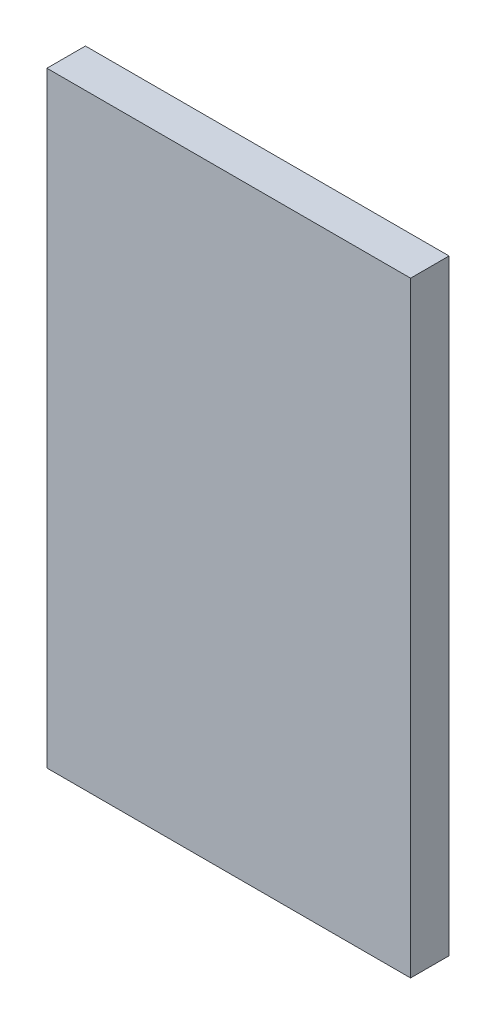
ISO-10303-21;
HEADER;
FILE_DESCRIPTION(('STEP AP214'),'2;1');
FILE_NAME('part.step','',(''),(''),'','','');
FILE_SCHEMA(('AUTOMOTIVE_DESIGN { 1 0 10303 214 1 1 1 1 }'));
ENDSEC;
DATA;
#1=APPLICATION_CONTEXT('core data for automotive mechanical design processes');
#2=APPLICATION_PROTOCOL_DEFINITION('international standard','automotive_design',2000,#1);
#3=PRODUCT_CONTEXT('',#1,'mechanical');
#4=PRODUCT('Part','Part','',(#3));
#5=PRODUCT_RELATED_PRODUCT_CATEGORY('part','',(#4));
#6=PRODUCT_DEFINITION_FORMATION('','',#4);
#7=PRODUCT_DEFINITION_CONTEXT('part definition',#1,'design');
#8=PRODUCT_DEFINITION('design','',#6,#7);
#9=PRODUCT_DEFINITION_SHAPE('','',#8);
#10=(LENGTH_UNIT() NAMED_UNIT(*) SI_UNIT(.MILLI.,.METRE.));
#11=(NAMED_UNIT(*) PLANE_ANGLE_UNIT() SI_UNIT($,.RADIAN.));
#12=(NAMED_UNIT(*) SI_UNIT($,.STERADIAN.) SOLID_ANGLE_UNIT());
#13=UNCERTAINTY_MEASURE_WITH_UNIT(LENGTH_MEASURE(1.E-05),#10,'distance_accuracy_value','');
#14=(GEOMETRIC_REPRESENTATION_CONTEXT(3) GLOBAL_UNCERTAINTY_ASSIGNED_CONTEXT((#13)) GLOBAL_UNIT_ASSIGNED_CONTEXT((#10,
#11,#12)) REPRESENTATION_CONTEXT('',''));
#15=CARTESIAN_POINT('',(0.,0.,0.));
#16=DIRECTION('',(0.,0.,1.));
#17=DIRECTION('',(1.,0.,0.));
#18=AXIS2_PLACEMENT_3D('',#15,#16,#17);
#19=CARTESIAN_POINT('',(0.,0.,6.35));
#20=DIRECTION('',(1.,0.,0.));
#21=DIRECTION('',(0.,1.,0.));
#22=AXIS2_PLACEMENT_3D('',#19,#20,#21);
#23=PLANE('',#22);
#24=DIRECTION('',(0.,-1.,0.));
#25=VECTOR('',#24,1.);
#26=CARTESIAN_POINT('',(0.,0.,0.));
#27=LINE('',#26,#25);
#28=CARTESIAN_POINT('',(0.,100.,0.));
#29=VERTEX_POINT('',#28);
#30=CARTESIAN_POINT('',(0.,0.,0.));
#31=VERTEX_POINT('',#30);
#32=EDGE_CURVE('E107',#29,#31,#27,.T.);
#33=ORIENTED_EDGE('',*,*,#32,.T.);
#34=DIRECTION('',(0.,0.,-1.));
#35=VECTOR('',#34,1.);
#36=CARTESIAN_POINT('',(0.,0.,6.35));
#37=LINE('',#36,#35);
#38=CARTESIAN_POINT('',(0.,0.,6.35));
#39=VERTEX_POINT('',#38);
#40=EDGE_CURVE('E11',#39,#31,#37,.T.);
#41=ORIENTED_EDGE('',*,*,#40,.F.);
#42=DIRECTION('',(0.,-1.,0.));
#43=VECTOR('',#42,1.);
#44=CARTESIAN_POINT('',(0.,0.,6.35));
#45=LINE('',#44,#43);
#46=CARTESIAN_POINT('',(0.,100.,6.35));
#47=VERTEX_POINT('',#46);
#48=EDGE_CURVE('E91',#47,#39,#45,.T.);
#49=ORIENTED_EDGE('',*,*,#48,.F.);
#50=DIRECTION('',(0.,0.,-1.));
#51=VECTOR('',#50,1.);
#52=CARTESIAN_POINT('',(0.,100.,6.35));
#53=LINE('',#52,#51);
#54=EDGE_CURVE('E103',#47,#29,#53,.T.);
#55=ORIENTED_EDGE('',*,*,#54,.T.);
#56=EDGE_LOOP('',(#33,#41,#49,#55));
#57=FACE_BOUND('',#56,.T.);
#58=ADVANCED_FACE('F39',(#57),#23,.F.);
#59=CARTESIAN_POINT('',(0.,0.,6.35));
#60=DIRECTION('',(0.,1.,0.));
#61=DIRECTION('',(0.,0.,1.));
#62=AXIS2_PLACEMENT_3D('',#59,#60,#61);
#63=PLANE('',#62);
#64=DIRECTION('',(1.,0.,0.));
#65=VECTOR('',#64,1.);
#66=CARTESIAN_POINT('',(0.,0.,0.));
#67=LINE('',#66,#65);
#68=CARTESIAN_POINT('',(60.,0.,0.));
#69=VERTEX_POINT('',#68);
#70=EDGE_CURVE('E96',#31,#69,#67,.T.);
#71=ORIENTED_EDGE('',*,*,#70,.T.);
#72=DIRECTION('',(0.,0.,-1.));
#73=VECTOR('',#72,1.);
#74=CARTESIAN_POINT('',(60.,0.,6.35));
#75=LINE('',#74,#73);
#76=CARTESIAN_POINT('',(60.,0.,6.35));
#77=VERTEX_POINT('',#76);
#78=EDGE_CURVE('E48',#77,#69,#75,.T.);
#79=ORIENTED_EDGE('',*,*,#78,.F.);
#80=DIRECTION('',(1.,0.,0.));
#81=VECTOR('',#80,1.);
#82=CARTESIAN_POINT('',(0.,0.,6.35));
#83=LINE('',#82,#81);
#84=EDGE_CURVE('E86',#39,#77,#83,.T.);
#85=ORIENTED_EDGE('',*,*,#84,.F.);
#86=ORIENTED_EDGE('',*,*,#40,.T.);
#87=EDGE_LOOP('',(#71,#79,#85,#86));
#88=FACE_BOUND('',#87,.T.);
#89=ADVANCED_FACE('F95',(#88),#63,.F.);
#90=CARTESIAN_POINT('',(60.,0.,6.35));
#91=DIRECTION('',(-1.,0.,0.));
#92=DIRECTION('',(0.,-1.,0.));
#93=AXIS2_PLACEMENT_3D('',#90,#91,#92);
#94=PLANE('',#93);
#95=DIRECTION('',(0.,1.,0.));
#96=VECTOR('',#95,1.);
#97=CARTESIAN_POINT('',(60.,0.,0.));
#98=LINE('',#97,#96);
#99=CARTESIAN_POINT('',(60.,100.,0.));
#100=VERTEX_POINT('',#99);
#101=EDGE_CURVE('E73',#69,#100,#98,.T.);
#102=ORIENTED_EDGE('',*,*,#101,.T.);
#103=DIRECTION('',(0.,0.,-1.));
#104=VECTOR('',#103,1.);
#105=CARTESIAN_POINT('',(60.,100.,6.35));
#106=LINE('',#105,#104);
#107=CARTESIAN_POINT('',(60.,100.,6.35));
#108=VERTEX_POINT('',#107);
#109=EDGE_CURVE('E98',#108,#100,#106,.T.);
#110=ORIENTED_EDGE('',*,*,#109,.F.);
#111=DIRECTION('',(0.,1.,0.));
#112=VECTOR('',#111,1.);
#113=CARTESIAN_POINT('',(60.,0.,6.35));
#114=LINE('',#113,#112);
#115=EDGE_CURVE('E89',#77,#108,#114,.T.);
#116=ORIENTED_EDGE('',*,*,#115,.F.);
#117=ORIENTED_EDGE('',*,*,#78,.T.);
#118=EDGE_LOOP('',(#102,#110,#116,#117));
#119=FACE_BOUND('',#118,.T.);
#120=ADVANCED_FACE('F99',(#119),#94,.F.);
#121=CARTESIAN_POINT('',(0.,100.,6.35));
#122=DIRECTION('',(0.,-1.,0.));
#123=DIRECTION('',(0.,0.,-1.));
#124=AXIS2_PLACEMENT_3D('',#121,#122,#123);
#125=PLANE('',#124);
#126=DIRECTION('',(-1.,0.,0.));
#127=VECTOR('',#126,1.);
#128=CARTESIAN_POINT('',(0.,100.,0.));
#129=LINE('',#128,#127);
#130=EDGE_CURVE('E79',#100,#29,#129,.T.);
#131=ORIENTED_EDGE('',*,*,#130,.T.);
#132=ORIENTED_EDGE('',*,*,#54,.F.);
#133=DIRECTION('',(-1.,0.,0.));
#134=VECTOR('',#133,1.);
#135=CARTESIAN_POINT('',(0.,100.,6.35));
#136=LINE('',#135,#134);
#137=EDGE_CURVE('E56',#108,#47,#136,.T.);
#138=ORIENTED_EDGE('',*,*,#137,.F.);
#139=ORIENTED_EDGE('',*,*,#109,.T.);
#140=EDGE_LOOP('',(#131,#132,#138,#139));
#141=FACE_BOUND('',#140,.T.);
#142=ADVANCED_FACE('F120',(#141),#125,.F.);
#143=CARTESIAN_POINT('',(0.,0.,6.35));
#144=DIRECTION('',(0.,0.,-1.));
#145=DIRECTION('',(-1.,0.,0.));
#146=AXIS2_PLACEMENT_3D('',#143,#144,#145);
#147=PLANE('',#146);
#148=ORIENTED_EDGE('',*,*,#48,.T.);
#149=ORIENTED_EDGE('',*,*,#84,.T.);
#150=ORIENTED_EDGE('',*,*,#115,.T.);
#151=ORIENTED_EDGE('',*,*,#137,.T.);
#152=EDGE_LOOP('',(#148,#149,#150,#151));
#153=FACE_BOUND('',#152,.T.);
#154=ADVANCED_FACE('F87',(#153),#147,.F.);
#155=CARTESIAN_POINT('',(0.,0.,0.));
#156=DIRECTION('',(0.,0.,-1.));
#157=DIRECTION('',(-1.,0.,0.));
#158=AXIS2_PLACEMENT_3D('',#155,#156,#157);
#159=PLANE('',#158);
#160=ORIENTED_EDGE('',*,*,#32,.F.);
#161=ORIENTED_EDGE('',*,*,#130,.F.);
#162=ORIENTED_EDGE('',*,*,#101,.F.);
#163=ORIENTED_EDGE('',*,*,#70,.F.);
#164=EDGE_LOOP('',(#160,#161,#162,#163));
#165=FACE_BOUND('',#164,.T.);
#166=ADVANCED_FACE('F123',(#165),#159,.T.);
#167=CLOSED_SHELL('',(#58,#89,#120,#142,#154,#166));
#168=MANIFOLD_SOLID_BREP('B2',#167);
#169=ADVANCED_BREP_SHAPE_REPRESENTATION('',(#18,#168),#14);
#170=SHAPE_DEFINITION_REPRESENTATION(#9,#169);
ENDSEC;
END-ISO-10303-21;
